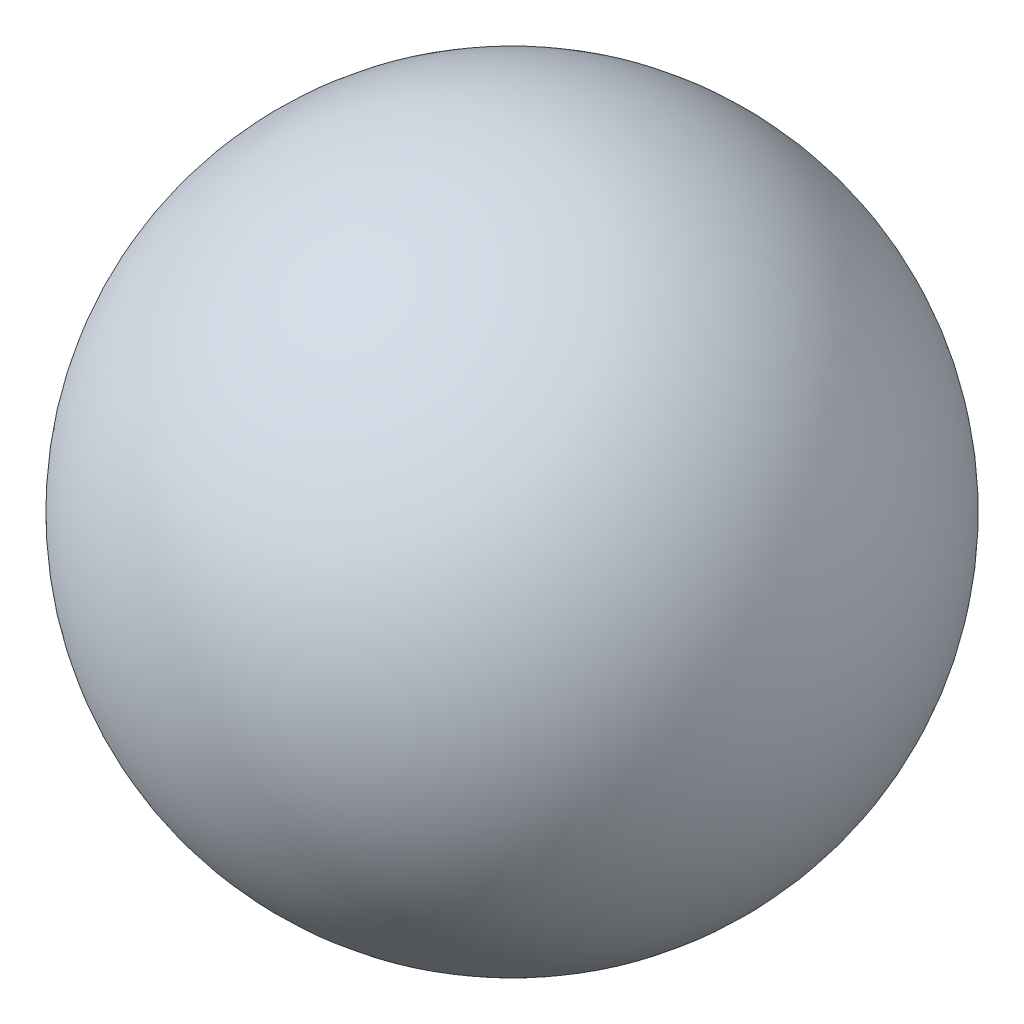
ISO-10303-21;
HEADER;
FILE_DESCRIPTION(('STEP AP214'),'2;1');
FILE_NAME('part.step','',(''),(''),'','','');
FILE_SCHEMA(('AUTOMOTIVE_DESIGN { 1 0 10303 214 1 1 1 1 }'));
ENDSEC;
DATA;
#1=APPLICATION_CONTEXT('core data for automotive mechanical design processes');
#2=APPLICATION_PROTOCOL_DEFINITION('international standard','automotive_design',2000,#1);
#3=PRODUCT_CONTEXT('',#1,'mechanical');
#4=PRODUCT('Part','Part','',(#3));
#5=PRODUCT_RELATED_PRODUCT_CATEGORY('part','',(#4));
#6=PRODUCT_DEFINITION_FORMATION('','',#4);
#7=PRODUCT_DEFINITION_CONTEXT('part definition',#1,'design');
#8=PRODUCT_DEFINITION('design','',#6,#7);
#9=PRODUCT_DEFINITION_SHAPE('','',#8);
#10=(LENGTH_UNIT() NAMED_UNIT(*) SI_UNIT(.MILLI.,.METRE.));
#11=(NAMED_UNIT(*) PLANE_ANGLE_UNIT() SI_UNIT($,.RADIAN.));
#12=(NAMED_UNIT(*) SI_UNIT($,.STERADIAN.) SOLID_ANGLE_UNIT());
#13=UNCERTAINTY_MEASURE_WITH_UNIT(LENGTH_MEASURE(1.E-05),#10,'distance_accuracy_value','');
#14=(GEOMETRIC_REPRESENTATION_CONTEXT(3) GLOBAL_UNCERTAINTY_ASSIGNED_CONTEXT((#13)) GLOBAL_UNIT_ASSIGNED_CONTEXT((#10,
#11,#12)) REPRESENTATION_CONTEXT('',''));
#15=CARTESIAN_POINT('',(0.,0.,0.));
#16=DIRECTION('',(0.,0.,1.));
#17=DIRECTION('',(1.,0.,0.));
#18=AXIS2_PLACEMENT_3D('',#15,#16,#17);
#19=CARTESIAN_POINT('',(0.,4.,0.));
#20=DIRECTION('',(0.,1.,0.));
#21=DIRECTION('',(1.,0.,0.));
#22=AXIS2_PLACEMENT_3D('',#19,#20,#21);
#23=SPHERICAL_SURFACE('',#22,4.);
#24=CARTESIAN_POINT('',(0.,8.,0.));
#25=VERTEX_POINT('',#24);
#26=VERTEX_LOOP('',#25);
#27=FACE_BOUND('',#26,.T.);
#28=ADVANCED_FACE('F35',(#27),#23,.T.);
#29=CLOSED_SHELL('',(#28));
#30=MANIFOLD_SOLID_BREP('B2',#29);
#31=ADVANCED_BREP_SHAPE_REPRESENTATION('',(#18,#30),#14);
#32=SHAPE_DEFINITION_REPRESENTATION(#9,#31);
ENDSEC;
END-ISO-10303-21;
